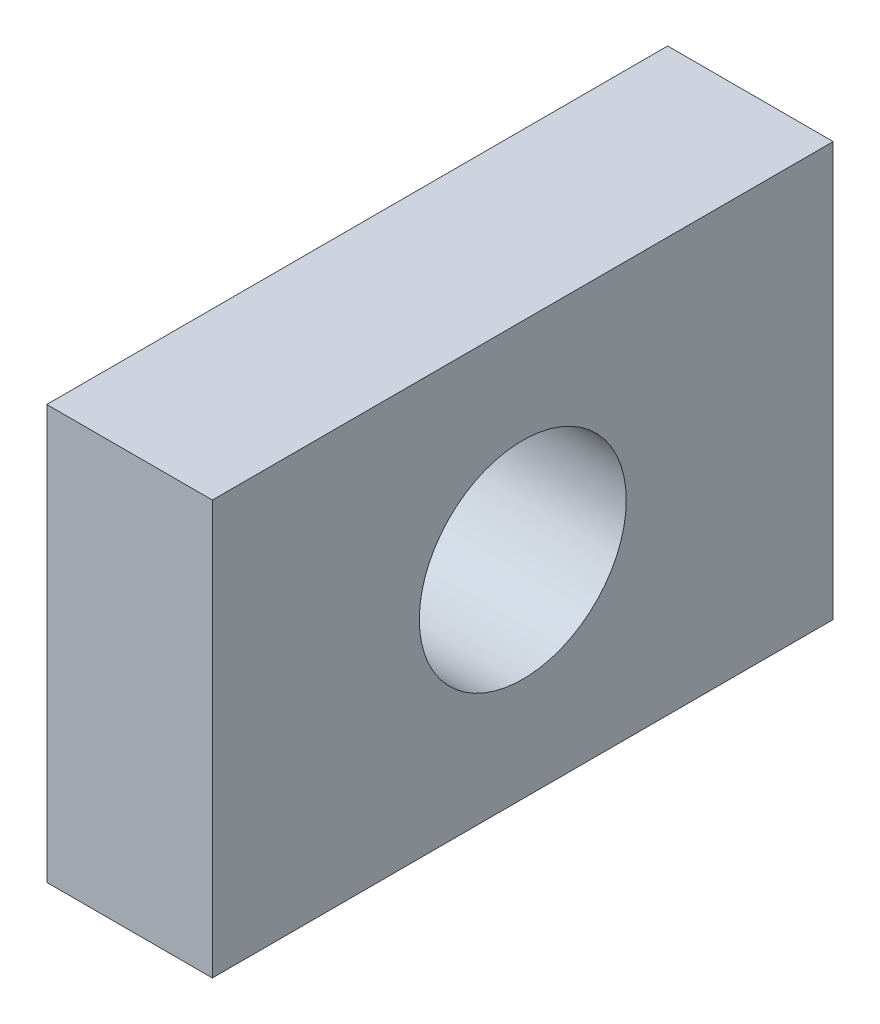
ISO-10303-21;
HEADER;
FILE_DESCRIPTION(('STEP AP214'),'2;1');
FILE_NAME('part.step','',(''),(''),'','','');
FILE_SCHEMA(('AUTOMOTIVE_DESIGN { 1 0 10303 214 1 1 1 1 }'));
ENDSEC;
DATA;
#1=APPLICATION_CONTEXT('core data for automotive mechanical design processes');
#2=APPLICATION_PROTOCOL_DEFINITION('international standard','automotive_design',2000,#1);
#3=PRODUCT_CONTEXT('',#1,'mechanical');
#4=PRODUCT('Part','Part','',(#3));
#5=PRODUCT_RELATED_PRODUCT_CATEGORY('part','',(#4));
#6=PRODUCT_DEFINITION_FORMATION('','',#4);
#7=PRODUCT_DEFINITION_CONTEXT('part definition',#1,'design');
#8=PRODUCT_DEFINITION('design','',#6,#7);
#9=PRODUCT_DEFINITION_SHAPE('','',#8);
#10=(LENGTH_UNIT() NAMED_UNIT(*) SI_UNIT(.MILLI.,.METRE.));
#11=(NAMED_UNIT(*) PLANE_ANGLE_UNIT() SI_UNIT($,.RADIAN.));
#12=(NAMED_UNIT(*) SI_UNIT($,.STERADIAN.) SOLID_ANGLE_UNIT());
#13=UNCERTAINTY_MEASURE_WITH_UNIT(LENGTH_MEASURE(1.E-05),#10,'distance_accuracy_value','');
#14=(GEOMETRIC_REPRESENTATION_CONTEXT(3) GLOBAL_UNCERTAINTY_ASSIGNED_CONTEXT((#13)) GLOBAL_UNIT_ASSIGNED_CONTEXT((#10,
#11,#12)) REPRESENTATION_CONTEXT('',''));
#15=CARTESIAN_POINT('',(0.,0.,0.));
#16=DIRECTION('',(0.,0.,1.));
#17=DIRECTION('',(1.,0.,0.));
#18=AXIS2_PLACEMENT_3D('',#15,#16,#17);
#19=CARTESIAN_POINT('',(40.,0.,0.));
#20=DIRECTION('',(1.,0.,0.));
#21=DIRECTION('',(0.,0.,-1.));
#22=AXIS2_PLACEMENT_3D('',#19,#20,#21);
#23=PLANE('',#22);
#24=DIRECTION('',(0.,-1.,0.));
#25=VECTOR('',#24,1.);
#26=CARTESIAN_POINT('',(40.,-50.,75.));
#27=LINE('',#26,#25);
#28=CARTESIAN_POINT('',(40.,50.,75.));
#29=VERTEX_POINT('',#28);
#30=CARTESIAN_POINT('',(40.,-50.,75.));
#31=VERTEX_POINT('',#30);
#32=EDGE_CURVE('E85',#29,#31,#27,.T.);
#33=ORIENTED_EDGE('',*,*,#32,.T.);
#34=DIRECTION('',(0.,0.,-1.));
#35=VECTOR('',#34,1.);
#36=CARTESIAN_POINT('',(40.,-50.,-75.));
#37=LINE('',#36,#35);
#38=CARTESIAN_POINT('',(40.,-50.,-75.));
#39=VERTEX_POINT('',#38);
#40=EDGE_CURVE('E80',#31,#39,#37,.T.);
#41=ORIENTED_EDGE('',*,*,#40,.T.);
#42=DIRECTION('',(0.,1.,0.));
#43=VECTOR('',#42,1.);
#44=CARTESIAN_POINT('',(40.,-50.,-75.));
#45=LINE('',#44,#43);
#46=CARTESIAN_POINT('',(40.,50.,-75.));
#47=VERTEX_POINT('',#46);
#48=EDGE_CURVE('E83',#39,#47,#45,.T.);
#49=ORIENTED_EDGE('',*,*,#48,.T.);
#50=DIRECTION('',(0.,0.,1.));
#51=VECTOR('',#50,1.);
#52=CARTESIAN_POINT('',(40.,50.,-75.));
#53=LINE('',#52,#51);
#54=EDGE_CURVE('E50',#47,#29,#53,.T.);
#55=ORIENTED_EDGE('',*,*,#54,.T.);
#56=EDGE_LOOP('',(#33,#41,#49,#55));
#57=FACE_BOUND('',#56,.T.);
#58=CARTESIAN_POINT('',(40.,0.,0.));
#59=DIRECTION('',(1.,0.,0.));
#60=DIRECTION('',(0.,0.,-1.));
#61=AXIS2_PLACEMENT_3D('',#58,#59,#60);
#62=CIRCLE('',#61,25.);
#63=CARTESIAN_POINT('',(40.,0.,-25.));
#64=VERTEX_POINT('',#63);
#65=EDGE_CURVE('E100',#64,#64,#62,.T.);
#66=ORIENTED_EDGE('',*,*,#65,.F.);
#67=EDGE_LOOP('',(#66));
#68=FACE_BOUND('',#67,.T.);
#69=ADVANCED_FACE('F33',(#57,#68),#23,.T.);
#70=CARTESIAN_POINT('',(0.,0.,0.));
#71=DIRECTION('',(1.,0.,0.));
#72=DIRECTION('',(0.,0.,-1.));
#73=AXIS2_PLACEMENT_3D('',#70,#71,#72);
#74=PLANE('',#73);
#75=DIRECTION('',(0.,-1.,0.));
#76=VECTOR('',#75,1.);
#77=CARTESIAN_POINT('',(0.,-50.,75.));
#78=LINE('',#77,#76);
#79=CARTESIAN_POINT('',(0.,50.,75.));
#80=VERTEX_POINT('',#79);
#81=CARTESIAN_POINT('',(0.,-50.,75.));
#82=VERTEX_POINT('',#81);
#83=EDGE_CURVE('E97',#80,#82,#78,.T.);
#84=ORIENTED_EDGE('',*,*,#83,.F.);
#85=DIRECTION('',(0.,0.,1.));
#86=VECTOR('',#85,1.);
#87=CARTESIAN_POINT('',(0.,50.,-75.));
#88=LINE('',#87,#86);
#89=CARTESIAN_POINT('',(0.,50.,-75.));
#90=VERTEX_POINT('',#89);
#91=EDGE_CURVE('E73',#90,#80,#88,.T.);
#92=ORIENTED_EDGE('',*,*,#91,.F.);
#93=DIRECTION('',(0.,1.,0.));
#94=VECTOR('',#93,1.);
#95=CARTESIAN_POINT('',(0.,-50.,-75.));
#96=LINE('',#95,#94);
#97=CARTESIAN_POINT('',(0.,-50.,-75.));
#98=VERTEX_POINT('',#97);
#99=EDGE_CURVE('E67',#98,#90,#96,.T.);
#100=ORIENTED_EDGE('',*,*,#99,.F.);
#101=DIRECTION('',(0.,0.,-1.));
#102=VECTOR('',#101,1.);
#103=CARTESIAN_POINT('',(0.,-50.,-75.));
#104=LINE('',#103,#102);
#105=EDGE_CURVE('E89',#82,#98,#104,.T.);
#106=ORIENTED_EDGE('',*,*,#105,.F.);
#107=EDGE_LOOP('',(#84,#92,#100,#106));
#108=FACE_BOUND('',#107,.T.);
#109=CARTESIAN_POINT('',(0.,0.,0.));
#110=DIRECTION('',(1.,0.,0.));
#111=DIRECTION('',(0.,0.,-1.));
#112=AXIS2_PLACEMENT_3D('',#109,#110,#111);
#113=CIRCLE('',#112,25.);
#114=CARTESIAN_POINT('',(0.,0.,-25.));
#115=VERTEX_POINT('',#114);
#116=EDGE_CURVE('E112',#115,#115,#113,.T.);
#117=ORIENTED_EDGE('',*,*,#116,.T.);
#118=EDGE_LOOP('',(#117));
#119=FACE_BOUND('',#118,.T.);
#120=ADVANCED_FACE('F108',(#108,#119),#74,.F.);
#121=CARTESIAN_POINT('',(40.,-50.,75.));
#122=DIRECTION('',(0.,0.,-1.));
#123=DIRECTION('',(-1.,0.,0.));
#124=AXIS2_PLACEMENT_3D('',#121,#122,#123);
#125=PLANE('',#124);
#126=ORIENTED_EDGE('',*,*,#83,.T.);
#127=DIRECTION('',(-1.,0.,0.));
#128=VECTOR('',#127,1.);
#129=CARTESIAN_POINT('',(40.,-50.,75.));
#130=LINE('',#129,#128);
#131=EDGE_CURVE('E11',#31,#82,#130,.T.);
#132=ORIENTED_EDGE('',*,*,#131,.F.);
#133=ORIENTED_EDGE('',*,*,#32,.F.);
#134=DIRECTION('',(-1.,0.,0.));
#135=VECTOR('',#134,1.);
#136=CARTESIAN_POINT('',(40.,50.,75.));
#137=LINE('',#136,#135);
#138=EDGE_CURVE('E93',#29,#80,#137,.T.);
#139=ORIENTED_EDGE('',*,*,#138,.T.);
#140=EDGE_LOOP('',(#126,#132,#133,#139));
#141=FACE_BOUND('',#140,.T.);
#142=ADVANCED_FACE('F35',(#141),#125,.F.);
#143=CARTESIAN_POINT('',(40.,-50.,-75.));
#144=DIRECTION('',(0.,1.,0.));
#145=DIRECTION('',(0.,0.,1.));
#146=AXIS2_PLACEMENT_3D('',#143,#144,#145);
#147=PLANE('',#146);
#148=ORIENTED_EDGE('',*,*,#105,.T.);
#149=DIRECTION('',(-1.,0.,0.));
#150=VECTOR('',#149,1.);
#151=CARTESIAN_POINT('',(40.,-50.,-75.));
#152=LINE('',#151,#150);
#153=EDGE_CURVE('E42',#39,#98,#152,.T.);
#154=ORIENTED_EDGE('',*,*,#153,.F.);
#155=ORIENTED_EDGE('',*,*,#40,.F.);
#156=ORIENTED_EDGE('',*,*,#131,.T.);
#157=EDGE_LOOP('',(#148,#154,#155,#156));
#158=FACE_BOUND('',#157,.T.);
#159=ADVANCED_FACE('F88',(#158),#147,.F.);
#160=CARTESIAN_POINT('',(40.,-50.,-75.));
#161=DIRECTION('',(0.,0.,1.));
#162=DIRECTION('',(1.,0.,0.));
#163=AXIS2_PLACEMENT_3D('',#160,#161,#162);
#164=PLANE('',#163);
#165=ORIENTED_EDGE('',*,*,#99,.T.);
#166=DIRECTION('',(-1.,0.,0.));
#167=VECTOR('',#166,1.);
#168=CARTESIAN_POINT('',(40.,50.,-75.));
#169=LINE('',#168,#167);
#170=EDGE_CURVE('E90',#47,#90,#169,.T.);
#171=ORIENTED_EDGE('',*,*,#170,.F.);
#172=ORIENTED_EDGE('',*,*,#48,.F.);
#173=ORIENTED_EDGE('',*,*,#153,.T.);
#174=EDGE_LOOP('',(#165,#171,#172,#173));
#175=FACE_BOUND('',#174,.T.);
#176=ADVANCED_FACE('F91',(#175),#164,.F.);
#177=CARTESIAN_POINT('',(40.,50.,-75.));
#178=DIRECTION('',(0.,-1.,0.));
#179=DIRECTION('',(0.,0.,-1.));
#180=AXIS2_PLACEMENT_3D('',#177,#178,#179);
#181=PLANE('',#180);
#182=ORIENTED_EDGE('',*,*,#91,.T.);
#183=ORIENTED_EDGE('',*,*,#138,.F.);
#184=ORIENTED_EDGE('',*,*,#54,.F.);
#185=ORIENTED_EDGE('',*,*,#170,.T.);
#186=EDGE_LOOP('',(#182,#183,#184,#185));
#187=FACE_BOUND('',#186,.T.);
#188=ADVANCED_FACE('F105',(#187),#181,.F.);
#189=CARTESIAN_POINT('',(40.,0.,0.));
#190=DIRECTION('',(-1.,0.,0.));
#191=DIRECTION('',(0.,0.,1.));
#192=AXIS2_PLACEMENT_3D('',#189,#190,#191);
#193=CYLINDRICAL_SURFACE('',#192,25.);
#194=ORIENTED_EDGE('',*,*,#65,.T.);
#195=EDGE_LOOP('',(#194));
#196=FACE_BOUND('',#195,.T.);
#197=ORIENTED_EDGE('',*,*,#116,.F.);
#198=EDGE_LOOP('',(#197));
#199=FACE_BOUND('',#198,.T.);
#200=ADVANCED_FACE('F118',(#196,#199),#193,.F.);
#201=CLOSED_SHELL('',(#69,#120,#142,#159,#176,#188,#200));
#202=MANIFOLD_SOLID_BREP('B2',#201);
#203=ADVANCED_BREP_SHAPE_REPRESENTATION('',(#18,#202),#14);
#204=SHAPE_DEFINITION_REPRESENTATION(#9,#203);
ENDSEC;
END-ISO-10303-21;
